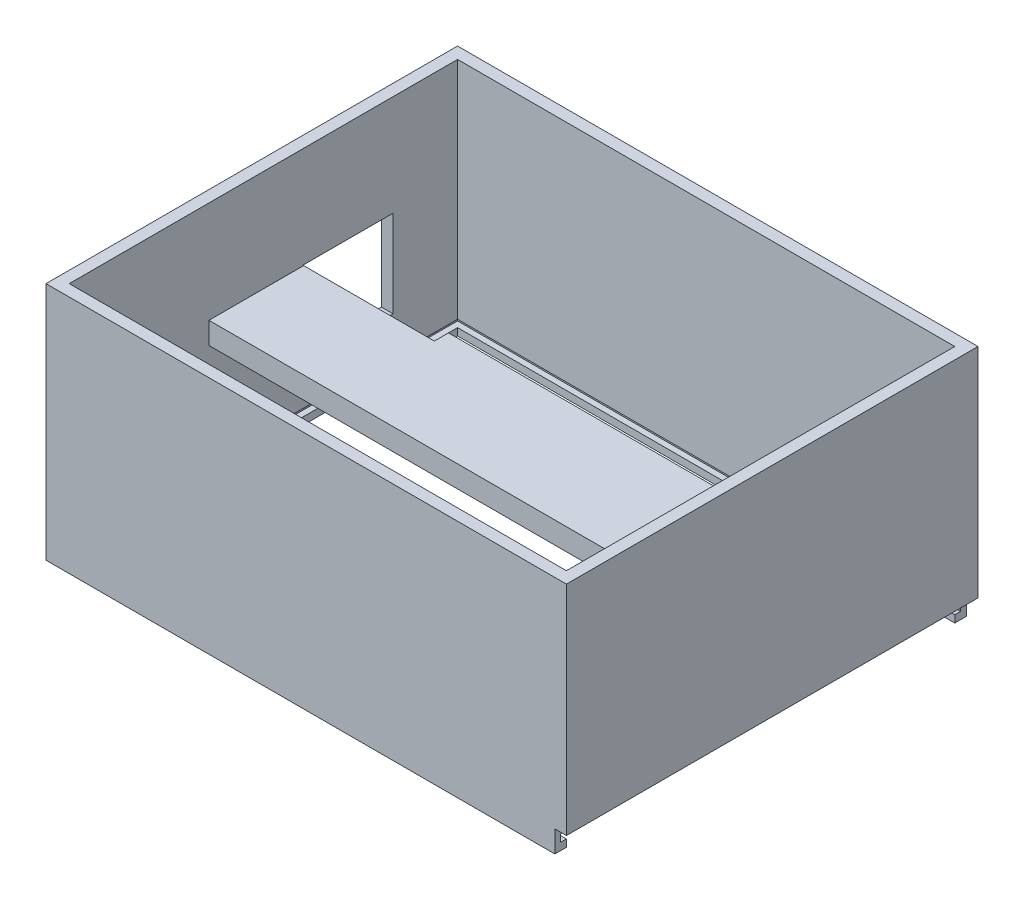
ISO-10303-21;
HEADER;
FILE_DESCRIPTION(('STEP AP214'),'2;1');
FILE_NAME('part.step','',(''),(''),'','','');
FILE_SCHEMA(('AUTOMOTIVE_DESIGN { 1 0 10303 214 1 1 1 1 }'));
ENDSEC;
DATA;
#1=APPLICATION_CONTEXT('core data for automotive mechanical design processes');
#2=APPLICATION_PROTOCOL_DEFINITION('international standard','automotive_design',2000,#1);
#3=PRODUCT_CONTEXT('',#1,'mechanical');
#4=PRODUCT('Part','Part','',(#3));
#5=PRODUCT_RELATED_PRODUCT_CATEGORY('part','',(#4));
#6=PRODUCT_DEFINITION_FORMATION('','',#4);
#7=PRODUCT_DEFINITION_CONTEXT('part definition',#1,'design');
#8=PRODUCT_DEFINITION('design','',#6,#7);
#9=PRODUCT_DEFINITION_SHAPE('','',#8);
#10=(LENGTH_UNIT() NAMED_UNIT(*) SI_UNIT(.MILLI.,.METRE.));
#11=(NAMED_UNIT(*) PLANE_ANGLE_UNIT() SI_UNIT($,.RADIAN.));
#12=(NAMED_UNIT(*) SI_UNIT($,.STERADIAN.) SOLID_ANGLE_UNIT());
#13=UNCERTAINTY_MEASURE_WITH_UNIT(LENGTH_MEASURE(1.E-05),#10,'distance_accuracy_value','');
#14=(GEOMETRIC_REPRESENTATION_CONTEXT(3) GLOBAL_UNCERTAINTY_ASSIGNED_CONTEXT((#13)) GLOBAL_UNIT_ASSIGNED_CONTEXT((#10,
#11,#12)) REPRESENTATION_CONTEXT('',''));
#15=CARTESIAN_POINT('',(0.,0.,0.));
#16=DIRECTION('',(0.,0.,1.));
#17=DIRECTION('',(1.,0.,0.));
#18=AXIS2_PLACEMENT_3D('',#15,#16,#17);
#19=CARTESIAN_POINT('',(-33.0209693760518,30.,34.9955036156109));
#20=DIRECTION('',(1.,0.,0.));
#21=DIRECTION('',(0.,0.,-1.));
#22=AXIS2_PLACEMENT_3D('',#19,#20,#21);
#23=PLANE('',#22);
#24=DIRECTION('',(0.,0.,1.));
#25=VECTOR('',#24,1.);
#26=CARTESIAN_POINT('',(-33.0209693760518,-1.,34.9955036156109));
#27=LINE('',#26,#25);
#28=CARTESIAN_POINT('',(-33.0209693760518,-1.,-18.5044963843891));
#29=VERTEX_POINT('',#28);
#30=CARTESIAN_POINT('',(-33.0209693760518,-1.,34.9955036156109));
#31=VERTEX_POINT('',#30);
#32=EDGE_CURVE('E296',#29,#31,#27,.T.);
#33=ORIENTED_EDGE('',*,*,#32,.F.);
#34=DIRECTION('',(0.,-1.,0.));
#35=VECTOR('',#34,1.);
#36=CARTESIAN_POINT('',(-33.0209693760518,30.,-18.5044963843891));
#37=LINE('',#36,#35);
#38=CARTESIAN_POINT('',(-33.0209693760518,30.,-18.5044963843891));
#39=VERTEX_POINT('',#38);
#40=EDGE_CURVE('E460',#39,#29,#37,.T.);
#41=ORIENTED_EDGE('',*,*,#40,.F.);
#42=DIRECTION('',(0.,0.,1.));
#43=VECTOR('',#42,1.);
#44=CARTESIAN_POINT('',(-33.0209693760518,30.,34.9955036156109));
#45=LINE('',#44,#43);
#46=CARTESIAN_POINT('',(-33.0209693760518,30.,34.9955036156109));
#47=VERTEX_POINT('',#46);
#48=EDGE_CURVE('E449',#39,#47,#45,.T.);
#49=ORIENTED_EDGE('',*,*,#48,.T.);
#50=DIRECTION('',(0.,-1.,0.));
#51=VECTOR('',#50,1.);
#52=CARTESIAN_POINT('',(-33.0209693760518,30.,34.9955036156109));
#53=LINE('',#52,#51);
#54=EDGE_CURVE('E470',#47,#31,#53,.T.);
#55=ORIENTED_EDGE('',*,*,#54,.T.);
#56=EDGE_LOOP('',(#33,#41,#49,#55));
#57=FACE_BOUND('',#56,.T.);
#58=DIRECTION('',(0.,-1.,0.));
#59=VECTOR('',#58,1.);
#60=CARTESIAN_POINT('',(-33.0209693760518,4.1,2.69550361561089));
#61=LINE('',#60,#59);
#62=CARTESIAN_POINT('',(-33.0209693760518,16.1,2.69550361561089));
#63=VERTEX_POINT('',#62);
#64=CARTESIAN_POINT('',(-33.0209693760518,16.,2.69550361561089));
#65=VERTEX_POINT('',#64);
#66=EDGE_CURVE('E410',#63,#65,#61,.T.);
#67=ORIENTED_EDGE('',*,*,#66,.F.);
#68=DIRECTION('',(0.,0.,1.));
#69=VECTOR('',#68,1.);
#70=CARTESIAN_POINT('',(-33.0209693760518,16.1,2.69550361561089));
#71=LINE('',#70,#69);
#72=CARTESIAN_POINT('',(-33.0209693760518,16.1,-9.60449638438911));
#73=VERTEX_POINT('',#72);
#74=EDGE_CURVE('E400',#73,#63,#71,.T.);
#75=ORIENTED_EDGE('',*,*,#74,.F.);
#76=DIRECTION('',(0.,1.,0.));
#77=VECTOR('',#76,1.);
#78=CARTESIAN_POINT('',(-33.0209693760518,4.1,-9.60449638438911));
#79=LINE('',#78,#77);
#80=CARTESIAN_POINT('',(-33.0209693760518,4.1,-9.60449638438911));
#81=VERTEX_POINT('',#80);
#82=EDGE_CURVE('E416',#81,#73,#79,.T.);
#83=ORIENTED_EDGE('',*,*,#82,.F.);
#84=DIRECTION('',(0.,0.,-1.));
#85=VECTOR('',#84,1.);
#86=CARTESIAN_POINT('',(-33.0209693760518,4.1,2.69550361561089));
#87=LINE('',#86,#85);
#88=CARTESIAN_POINT('',(-33.0209693760518,4.1,2.69550361561089));
#89=VERTEX_POINT('',#88);
#90=EDGE_CURVE('E413',#89,#81,#87,.T.);
#91=ORIENTED_EDGE('',*,*,#90,.F.);
#92=CARTESIAN_POINT('',(-33.0209693760518,13.,2.69550361561089));
#93=VERTEX_POINT('',#92);
#94=EDGE_CURVE('E389',#93,#89,#61,.T.);
#95=ORIENTED_EDGE('',*,*,#94,.F.);
#96=DIRECTION('',(0.,0.,-1.));
#97=VECTOR('',#96,1.);
#98=CARTESIAN_POINT('',(-33.0209693760518,13.,15.7455036156109));
#99=LINE('',#98,#97);
#100=CARTESIAN_POINT('',(-33.0209693760518,13.,15.7455036156109));
#101=VERTEX_POINT('',#100);
#102=EDGE_CURVE('E432',#101,#93,#99,.T.);
#103=ORIENTED_EDGE('',*,*,#102,.F.);
#104=DIRECTION('',(0.,-1.,0.));
#105=VECTOR('',#104,1.);
#106=CARTESIAN_POINT('',(-33.0209693760518,13.,15.7455036156109));
#107=LINE('',#106,#105);
#108=CARTESIAN_POINT('',(-33.0209693760518,16.,15.7455036156109));
#109=VERTEX_POINT('',#108);
#110=EDGE_CURVE('E423',#109,#101,#107,.T.);
#111=ORIENTED_EDGE('',*,*,#110,.F.);
#112=DIRECTION('',(0.,0.,1.));
#113=VECTOR('',#112,1.);
#114=CARTESIAN_POINT('',(-33.0209693760518,16.,15.7455036156109));
#115=LINE('',#114,#113);
#116=EDGE_CURVE('E435',#65,#109,#115,.T.);
#117=ORIENTED_EDGE('',*,*,#116,.F.);
#118=EDGE_LOOP('',(#67,#75,#83,#91,#95,#103,#111,#117));
#119=FACE_BOUND('',#118,.T.);
#120=DIRECTION('',(0.,-1.,0.));
#121=VECTOR('',#120,1.);
#122=CARTESIAN_POINT('',(-33.0209693760518,4.1,31.7955036156109));
#123=LINE('',#122,#121);
#124=CARTESIAN_POINT('',(-33.0209693760518,15.1,31.7955036156109));
#125=VERTEX_POINT('',#124);
#126=CARTESIAN_POINT('',(-33.0209693760518,4.1,31.7955036156109));
#127=VERTEX_POINT('',#126);
#128=EDGE_CURVE('E363',#125,#127,#123,.T.);
#129=ORIENTED_EDGE('',*,*,#128,.F.);
#130=DIRECTION('',(0.,0.,1.));
#131=VECTOR('',#130,1.);
#132=CARTESIAN_POINT('',(-33.0209693760518,15.1,31.7955036156109));
#133=LINE('',#132,#131);
#134=CARTESIAN_POINT('',(-33.0209693760518,15.1,22.4955036156109));
#135=VERTEX_POINT('',#134);
#136=EDGE_CURVE('E368',#135,#125,#133,.T.);
#137=ORIENTED_EDGE('',*,*,#136,.F.);
#138=DIRECTION('',(0.,1.,0.));
#139=VECTOR('',#138,1.);
#140=CARTESIAN_POINT('',(-33.0209693760518,4.1,22.4955036156109));
#141=LINE('',#140,#139);
#142=CARTESIAN_POINT('',(-33.0209693760518,4.1,22.4955036156109));
#143=VERTEX_POINT('',#142);
#144=EDGE_CURVE('E382',#143,#135,#141,.T.);
#145=ORIENTED_EDGE('',*,*,#144,.F.);
#146=DIRECTION('',(0.,0.,-1.));
#147=VECTOR('',#146,1.);
#148=CARTESIAN_POINT('',(-33.0209693760518,4.1,31.7955036156109));
#149=LINE('',#148,#147);
#150=EDGE_CURVE('E379',#127,#143,#149,.T.);
#151=ORIENTED_EDGE('',*,*,#150,.F.);
#152=EDGE_LOOP('',(#129,#137,#145,#151));
#153=FACE_BOUND('',#152,.T.);
#154=ADVANCED_FACE('F33',(#57,#119,#153),#23,.T.);
#155=CARTESIAN_POINT('',(-33.0209693760518,30.,34.9955036156109));
#156=DIRECTION('',(0.,0.,-1.));
#157=DIRECTION('',(-1.,0.,0.));
#158=AXIS2_PLACEMENT_3D('',#155,#156,#157);
#159=PLANE('',#158);
#160=DIRECTION('',(1.,0.,0.));
#161=VECTOR('',#160,1.);
#162=CARTESIAN_POINT('',(-33.0209693760518,-1.,34.9955036156109));
#163=LINE('',#162,#161);
#164=CARTESIAN_POINT('',(35.4790306239482,-1.,34.9955036156109));
#165=VERTEX_POINT('',#164);
#166=EDGE_CURVE('E298',#31,#165,#163,.T.);
#167=ORIENTED_EDGE('',*,*,#166,.F.);
#168=ORIENTED_EDGE('',*,*,#54,.F.);
#169=DIRECTION('',(1.,0.,0.));
#170=VECTOR('',#169,1.);
#171=CARTESIAN_POINT('',(-33.0209693760518,30.,34.9955036156109));
#172=LINE('',#171,#170);
#173=CARTESIAN_POINT('',(35.4790306239482,30.,34.9955036156109));
#174=VERTEX_POINT('',#173);
#175=EDGE_CURVE('E451',#47,#174,#172,.T.);
#176=ORIENTED_EDGE('',*,*,#175,.T.);
#177=DIRECTION('',(0.,-1.,0.));
#178=VECTOR('',#177,1.);
#179=CARTESIAN_POINT('',(35.4790306239482,30.,34.9955036156109));
#180=LINE('',#179,#178);
#181=CARTESIAN_POINT('',(35.4790306239482,0.,34.9955036156109));
#182=VERTEX_POINT('',#181);
#183=EDGE_CURVE('E466',#174,#182,#180,.T.);
#184=ORIENTED_EDGE('',*,*,#183,.T.);
#185=DIRECTION('',(0.,1.,0.));
#186=VECTOR('',#185,1.);
#187=CARTESIAN_POINT('',(35.4790306239482,-3.,34.9955036156109));
#188=LINE('',#187,#186);
#189=EDGE_CURVE('E333',#165,#182,#188,.T.);
#190=ORIENTED_EDGE('',*,*,#189,.F.);
#191=EDGE_LOOP('',(#167,#168,#176,#184,#190));
#192=FACE_BOUND('',#191,.T.);
#193=ADVANCED_FACE('F531',(#192),#159,.T.);
#194=CARTESIAN_POINT('',(-33.0209693760518,30.,-18.5044963843891));
#195=DIRECTION('',(0.,0.,1.));
#196=DIRECTION('',(1.,0.,0.));
#197=AXIS2_PLACEMENT_3D('',#194,#195,#196);
#198=PLANE('',#197);
#199=DIRECTION('',(-1.,0.,0.));
#200=VECTOR('',#199,1.);
#201=CARTESIAN_POINT('',(-33.0209693760518,-1.,-18.5044963843891));
#202=LINE('',#201,#200);
#203=CARTESIAN_POINT('',(35.4790306239482,-1.,-18.5044963843891));
#204=VERTEX_POINT('',#203);
#205=EDGE_CURVE('E294',#204,#29,#202,.T.);
#206=ORIENTED_EDGE('',*,*,#205,.F.);
#207=DIRECTION('',(0.,1.,0.));
#208=VECTOR('',#207,1.);
#209=CARTESIAN_POINT('',(35.4790306239482,-3.,-18.5044963843891));
#210=LINE('',#209,#208);
#211=CARTESIAN_POINT('',(35.4790306239482,0.,-18.5044963843891));
#212=VERTEX_POINT('',#211);
#213=EDGE_CURVE('E341',#204,#212,#210,.T.);
#214=ORIENTED_EDGE('',*,*,#213,.T.);
#215=DIRECTION('',(0.,-1.,0.));
#216=VECTOR('',#215,1.);
#217=CARTESIAN_POINT('',(35.4790306239482,30.,-18.5044963843891));
#218=LINE('',#217,#216);
#219=CARTESIAN_POINT('',(35.4790306239482,30.,-18.5044963843891));
#220=VERTEX_POINT('',#219);
#221=EDGE_CURVE('E463',#220,#212,#218,.T.);
#222=ORIENTED_EDGE('',*,*,#221,.F.);
#223=DIRECTION('',(-1.,0.,0.));
#224=VECTOR('',#223,1.);
#225=CARTESIAN_POINT('',(-33.0209693760518,30.,-18.5044963843891));
#226=LINE('',#225,#224);
#227=EDGE_CURVE('E456',#220,#39,#226,.T.);
#228=ORIENTED_EDGE('',*,*,#227,.T.);
#229=ORIENTED_EDGE('',*,*,#40,.T.);
#230=EDGE_LOOP('',(#206,#214,#222,#228,#229));
#231=FACE_BOUND('',#230,.T.);
#232=ADVANCED_FACE('F520',(#231),#198,.T.);
#233=CARTESIAN_POINT('',(0.,0.,0.));
#234=DIRECTION('',(0.,1.,0.));
#235=DIRECTION('',(0.,0.,1.));
#236=AXIS2_PLACEMENT_3D('',#233,#234,#235);
#237=PLANE('',#236);
#238=DIRECTION('',(0.,0.,1.));
#239=VECTOR('',#238,1.);
#240=CARTESIAN_POINT('',(35.4790306239482,0.,36.5955036156109));
#241=LINE('',#240,#239);
#242=CARTESIAN_POINT('',(35.4790306239482,0.,36.5955036156109));
#243=VERTEX_POINT('',#242);
#244=EDGE_CURVE('E305',#182,#243,#241,.T.);
#245=ORIENTED_EDGE('',*,*,#244,.F.);
#246=DIRECTION('',(0.,0.,-1.));
#247=VECTOR('',#246,1.);
#248=CARTESIAN_POINT('',(35.4790306239482,0.,34.9955036156109));
#249=LINE('',#248,#247);
#250=EDGE_CURVE('E448',#182,#212,#249,.T.);
#251=ORIENTED_EDGE('',*,*,#250,.T.);
#252=DIRECTION('',(0.,0.,1.));
#253=VECTOR('',#252,1.);
#254=CARTESIAN_POINT('',(35.4790306239482,0.,-18.5044963843891));
#255=LINE('',#254,#253);
#256=CARTESIAN_POINT('',(35.4790306239482,0.,-20.1044963843891));
#257=VERTEX_POINT('',#256);
#258=EDGE_CURVE('E300',#257,#212,#255,.T.);
#259=ORIENTED_EDGE('',*,*,#258,.F.);
#260=DIRECTION('',(-1.,0.,0.));
#261=VECTOR('',#260,1.);
#262=CARTESIAN_POINT('',(-34.6209693760518,0.,-20.1044963843891));
#263=LINE('',#262,#261);
#264=CARTESIAN_POINT('',(37.0790306239482,0.,-20.1044963843891));
#265=VERTEX_POINT('',#264);
#266=EDGE_CURVE('E477',#265,#257,#263,.T.);
#267=ORIENTED_EDGE('',*,*,#266,.F.);
#268=DIRECTION('',(0.,0.,-1.));
#269=VECTOR('',#268,1.);
#270=CARTESIAN_POINT('',(37.0790306239482,0.,-20.1044963843891));
#271=LINE('',#270,#269);
#272=CARTESIAN_POINT('',(37.0790306239482,0.,36.5955036156109));
#273=VERTEX_POINT('',#272);
#274=EDGE_CURVE('E486',#273,#265,#271,.T.);
#275=ORIENTED_EDGE('',*,*,#274,.F.);
#276=DIRECTION('',(1.,0.,0.));
#277=VECTOR('',#276,1.);
#278=CARTESIAN_POINT('',(-34.6209693760518,0.,36.5955036156109));
#279=LINE('',#278,#277);
#280=EDGE_CURVE('E56',#243,#273,#279,.T.);
#281=ORIENTED_EDGE('',*,*,#280,.F.);
#282=EDGE_LOOP('',(#245,#251,#259,#267,#275,#281));
#283=FACE_BOUND('',#282,.T.);
#284=ADVANCED_FACE('F517',(#283),#237,.F.);
#285=CARTESIAN_POINT('',(36.9790306239482,13.,15.7455036156109));
#286=DIRECTION('',(0.,1.,0.));
#287=DIRECTION('',(0.,0.,1.));
#288=AXIS2_PLACEMENT_3D('',#285,#286,#287);
#289=PLANE('',#288);
#290=DIRECTION('',(-1.,0.,0.));
#291=VECTOR('',#290,1.);
#292=CARTESIAN_POINT('',(36.9790306239482,13.,2.69550361561089));
#293=LINE('',#292,#291);
#294=CARTESIAN_POINT('',(-15.0209693760518,13.,2.69550361561089));
#295=VERTEX_POINT('',#294);
#296=EDGE_CURVE('E357',#295,#93,#293,.T.);
#297=ORIENTED_EDGE('',*,*,#296,.F.);
#298=DIRECTION('',(0.,0.,1.));
#299=VECTOR('',#298,1.);
#300=CARTESIAN_POINT('',(-15.0209693760518,13.,15.7455036156109));
#301=LINE('',#300,#299);
#302=CARTESIAN_POINT('',(-15.0209693760518,13.,0.745503615610894));
#303=VERTEX_POINT('',#302);
#304=EDGE_CURVE('E361',#303,#295,#301,.T.);
#305=ORIENTED_EDGE('',*,*,#304,.F.);
#306=DIRECTION('',(-1.,0.,0.));
#307=VECTOR('',#306,1.);
#308=CARTESIAN_POINT('',(36.9790306239482,13.,0.745503615610894));
#309=LINE('',#308,#307);
#310=CARTESIAN_POINT('',(35.4790306239482,13.,0.745503615610894));
#311=VERTEX_POINT('',#310);
#312=EDGE_CURVE('E443',#311,#303,#309,.T.);
#313=ORIENTED_EDGE('',*,*,#312,.F.);
#314=DIRECTION('',(0.,0.,-1.));
#315=VECTOR('',#314,1.);
#316=CARTESIAN_POINT('',(35.4790306239482,13.,34.9955036156109));
#317=LINE('',#316,#315);
#318=CARTESIAN_POINT('',(35.4790306239482,13.,15.7455036156109));
#319=VERTEX_POINT('',#318);
#320=EDGE_CURVE('E616',#319,#311,#317,.T.);
#321=ORIENTED_EDGE('',*,*,#320,.F.);
#322=DIRECTION('',(-1.,0.,0.));
#323=VECTOR('',#322,1.);
#324=CARTESIAN_POINT('',(36.9790306239482,13.,15.7455036156109));
#325=LINE('',#324,#323);
#326=EDGE_CURVE('E446',#319,#101,#325,.T.);
#327=ORIENTED_EDGE('',*,*,#326,.T.);
#328=ORIENTED_EDGE('',*,*,#102,.T.);
#329=EDGE_LOOP('',(#297,#305,#313,#321,#327,#328));
#330=FACE_BOUND('',#329,.T.);
#331=ADVANCED_FACE('F519',(#330),#289,.F.);
#332=CARTESIAN_POINT('',(36.9790306239482,13.,0.745503615610894));
#333=DIRECTION('',(0.,0.,1.));
#334=DIRECTION('',(1.,0.,0.));
#335=AXIS2_PLACEMENT_3D('',#332,#333,#334);
#336=PLANE('',#335);
#337=DIRECTION('',(0.,-1.,0.));
#338=VECTOR('',#337,1.);
#339=CARTESIAN_POINT('',(-15.0209693760518,13.,0.745503615610894));
#340=LINE('',#339,#338);
#341=CARTESIAN_POINT('',(-15.0209693760518,16.,0.745503615610894));
#342=VERTEX_POINT('',#341);
#343=EDGE_CURVE('E359',#342,#303,#340,.T.);
#344=ORIENTED_EDGE('',*,*,#343,.F.);
#345=DIRECTION('',(-1.,0.,0.));
#346=VECTOR('',#345,1.);
#347=CARTESIAN_POINT('',(36.9790306239482,16.,0.745503615610894));
#348=LINE('',#347,#346);
#349=CARTESIAN_POINT('',(35.4790306239482,16.,0.745503615610894));
#350=VERTEX_POINT('',#349);
#351=EDGE_CURVE('E440',#350,#342,#348,.T.);
#352=ORIENTED_EDGE('',*,*,#351,.F.);
#353=DIRECTION('',(0.,1.,0.));
#354=VECTOR('',#353,1.);
#355=CARTESIAN_POINT('',(35.4790306239482,30.,0.74550361561089));
#356=LINE('',#355,#354);
#357=EDGE_CURVE('E609',#311,#350,#356,.T.);
#358=ORIENTED_EDGE('',*,*,#357,.F.);
#359=ORIENTED_EDGE('',*,*,#312,.T.);
#360=EDGE_LOOP('',(#344,#352,#358,#359));
#361=FACE_BOUND('',#360,.T.);
#362=ADVANCED_FACE('F527',(#361),#336,.F.);
#363=CARTESIAN_POINT('',(36.9790306239482,16.,15.7455036156109));
#364=DIRECTION('',(0.,-1.,0.));
#365=DIRECTION('',(0.,0.,-1.));
#366=AXIS2_PLACEMENT_3D('',#363,#364,#365);
#367=PLANE('',#366);
#368=DIRECTION('',(1.,0.,0.));
#369=VECTOR('',#368,1.);
#370=CARTESIAN_POINT('',(36.9790306239482,16.,2.69550361561089));
#371=LINE('',#370,#369);
#372=CARTESIAN_POINT('',(-15.0209693760518,16.,2.69550361561089));
#373=VERTEX_POINT('',#372);
#374=EDGE_CURVE('E355',#65,#373,#371,.T.);
#375=ORIENTED_EDGE('',*,*,#374,.F.);
#376=ORIENTED_EDGE('',*,*,#116,.T.);
#377=DIRECTION('',(-1.,0.,0.));
#378=VECTOR('',#377,1.);
#379=CARTESIAN_POINT('',(36.9790306239482,16.,15.7455036156109));
#380=LINE('',#379,#378);
#381=CARTESIAN_POINT('',(35.4790306239482,16.,15.7455036156109));
#382=VERTEX_POINT('',#381);
#383=EDGE_CURVE('E437',#382,#109,#380,.T.);
#384=ORIENTED_EDGE('',*,*,#383,.F.);
#385=DIRECTION('',(0.,0.,1.));
#386=VECTOR('',#385,1.);
#387=CARTESIAN_POINT('',(35.4790306239482,16.,34.9955036156109));
#388=LINE('',#387,#386);
#389=EDGE_CURVE('E606',#350,#382,#388,.T.);
#390=ORIENTED_EDGE('',*,*,#389,.F.);
#391=ORIENTED_EDGE('',*,*,#351,.T.);
#392=DIRECTION('',(0.,0.,-1.));
#393=VECTOR('',#392,1.);
#394=CARTESIAN_POINT('',(-15.0209693760518,16.,15.7455036156109));
#395=LINE('',#394,#393);
#396=EDGE_CURVE('E41',#373,#342,#395,.T.);
#397=ORIENTED_EDGE('',*,*,#396,.F.);
#398=EDGE_LOOP('',(#375,#376,#384,#390,#391,#397));
#399=FACE_BOUND('',#398,.T.);
#400=ADVANCED_FACE('F551',(#399),#367,.F.);
#401=DIRECTION('',(0.,0.,-1.));
#402=VECTOR('',#401,1.);
#403=CARTESIAN_POINT('',(-33.0209693760518,-2.,34.9955036156109));
#404=LINE('',#403,#402);
#405=CARTESIAN_POINT('',(-33.0209693760518,-2.,34.9955036156109));
#406=VERTEX_POINT('',#405);
#407=CARTESIAN_POINT('',(-33.0209693760518,-2.,-18.5044963843891));
#408=VERTEX_POINT('',#407);
#409=EDGE_CURVE('E290',#406,#408,#404,.T.);
#410=ORIENTED_EDGE('',*,*,#409,.F.);
#411=CARTESIAN_POINT('',(-33.0209693760518,-3.,34.9955036156109));
#412=VERTEX_POINT('',#411);
#413=EDGE_CURVE('E469',#406,#412,#53,.T.);
#414=ORIENTED_EDGE('',*,*,#413,.T.);
#415=DIRECTION('',(0.,0.,1.));
#416=VECTOR('',#415,1.);
#417=CARTESIAN_POINT('',(-33.0209693760518,-3.,34.9955036156109));
#418=LINE('',#417,#416);
#419=CARTESIAN_POINT('',(-33.0209693760518,-3.,-18.5044963843891));
#420=VERTEX_POINT('',#419);
#421=EDGE_CURVE('E315',#420,#412,#418,.T.);
#422=ORIENTED_EDGE('',*,*,#421,.F.);
#423=EDGE_CURVE('E458',#408,#420,#37,.T.);
#424=ORIENTED_EDGE('',*,*,#423,.F.);
#425=EDGE_LOOP('',(#410,#414,#422,#424));
#426=FACE_BOUND('',#425,.T.);
#427=ADVANCED_FACE('F539',(#426),#23,.T.);
#428=CARTESIAN_POINT('',(35.4790306239482,30.,34.9955036156109));
#429=DIRECTION('',(-1.,0.,0.));
#430=DIRECTION('',(0.,0.,1.));
#431=AXIS2_PLACEMENT_3D('',#428,#429,#430);
#432=PLANE('',#431);
#433=ORIENTED_EDGE('',*,*,#250,.F.);
#434=ORIENTED_EDGE('',*,*,#183,.F.);
#435=DIRECTION('',(0.,0.,-1.));
#436=VECTOR('',#435,1.);
#437=CARTESIAN_POINT('',(35.4790306239482,30.,34.9955036156109));
#438=LINE('',#437,#436);
#439=EDGE_CURVE('E453',#174,#220,#438,.T.);
#440=ORIENTED_EDGE('',*,*,#439,.T.);
#441=ORIENTED_EDGE('',*,*,#221,.T.);
#442=EDGE_LOOP('',(#433,#434,#440,#441));
#443=FACE_BOUND('',#442,.T.);
#444=ORIENTED_EDGE('',*,*,#389,.T.);
#445=DIRECTION('',(0.,-1.,0.));
#446=VECTOR('',#445,1.);
#447=CARTESIAN_POINT('',(35.4790306239482,30.,15.7455036156109));
#448=LINE('',#447,#446);
#449=EDGE_CURVE('E619',#382,#319,#448,.T.);
#450=ORIENTED_EDGE('',*,*,#449,.T.);
#451=ORIENTED_EDGE('',*,*,#320,.T.);
#452=ORIENTED_EDGE('',*,*,#357,.T.);
#453=EDGE_LOOP('',(#444,#450,#451,#452));
#454=FACE_BOUND('',#453,.T.);
#455=ADVANCED_FACE('F550',(#443,#454),#432,.T.);
#456=CARTESIAN_POINT('',(0.,30.,0.));
#457=DIRECTION('',(0.,1.,0.));
#458=DIRECTION('',(0.,0.,1.));
#459=AXIS2_PLACEMENT_3D('',#456,#457,#458);
#460=PLANE('',#459);
#461=DIRECTION('',(0.,0.,1.));
#462=VECTOR('',#461,1.);
#463=CARTESIAN_POINT('',(-34.6209693760518,30.,-20.1044963843891));
#464=LINE('',#463,#462);
#465=CARTESIAN_POINT('',(-34.6209693760518,30.,-20.1044963843891));
#466=VERTEX_POINT('',#465);
#467=CARTESIAN_POINT('',(-34.6209693760518,30.,36.5955036156109));
#468=VERTEX_POINT('',#467);
#469=EDGE_CURVE('E473',#466,#468,#464,.T.);
#470=ORIENTED_EDGE('',*,*,#469,.T.);
#471=DIRECTION('',(1.,0.,0.));
#472=VECTOR('',#471,1.);
#473=CARTESIAN_POINT('',(-34.6209693760518,30.,36.5955036156109));
#474=LINE('',#473,#472);
#475=CARTESIAN_POINT('',(37.0790306239482,30.,36.5955036156109));
#476=VERTEX_POINT('',#475);
#477=EDGE_CURVE('E476',#468,#476,#474,.T.);
#478=ORIENTED_EDGE('',*,*,#477,.T.);
#479=DIRECTION('',(0.,0.,-1.));
#480=VECTOR('',#479,1.);
#481=CARTESIAN_POINT('',(37.0790306239482,30.,-20.1044963843891));
#482=LINE('',#481,#480);
#483=CARTESIAN_POINT('',(37.0790306239482,30.,-20.1044963843891));
#484=VERTEX_POINT('',#483);
#485=EDGE_CURVE('E479',#476,#484,#482,.T.);
#486=ORIENTED_EDGE('',*,*,#485,.T.);
#487=DIRECTION('',(-1.,0.,0.));
#488=VECTOR('',#487,1.);
#489=CARTESIAN_POINT('',(-34.6209693760518,30.,-20.1044963843891));
#490=LINE('',#489,#488);
#491=EDGE_CURVE('E481',#484,#466,#490,.T.);
#492=ORIENTED_EDGE('',*,*,#491,.T.);
#493=EDGE_LOOP('',(#470,#478,#486,#492));
#494=FACE_BOUND('',#493,.T.);
#495=ORIENTED_EDGE('',*,*,#175,.F.);
#496=ORIENTED_EDGE('',*,*,#48,.F.);
#497=ORIENTED_EDGE('',*,*,#227,.F.);
#498=ORIENTED_EDGE('',*,*,#439,.F.);
#499=EDGE_LOOP('',(#495,#496,#497,#498));
#500=FACE_BOUND('',#499,.T.);
#501=ADVANCED_FACE('F556',(#494,#500),#460,.T.);
#502=CARTESIAN_POINT('',(-34.6209693760518,30.,-20.1044963843891));
#503=DIRECTION('',(1.,0.,0.));
#504=DIRECTION('',(0.,0.,-1.));
#505=AXIS2_PLACEMENT_3D('',#502,#503,#504);
#506=PLANE('',#505);
#507=DIRECTION('',(0.,0.,1.));
#508=VECTOR('',#507,1.);
#509=CARTESIAN_POINT('',(-34.6209693760518,15.1,31.7955036156109));
#510=LINE('',#509,#508);
#511=CARTESIAN_POINT('',(-34.6209693760518,15.1,22.4955036156109));
#512=VERTEX_POINT('',#511);
#513=CARTESIAN_POINT('',(-34.6209693760518,15.1,31.7955036156109));
#514=VERTEX_POINT('',#513);
#515=EDGE_CURVE('E374',#512,#514,#510,.T.);
#516=ORIENTED_EDGE('',*,*,#515,.T.);
#517=DIRECTION('',(0.,-1.,0.));
#518=VECTOR('',#517,1.);
#519=CARTESIAN_POINT('',(-34.6209693760518,4.1,31.7955036156109));
#520=LINE('',#519,#518);
#521=CARTESIAN_POINT('',(-34.6209693760518,4.1,31.7955036156109));
#522=VERTEX_POINT('',#521);
#523=EDGE_CURVE('E364',#514,#522,#520,.T.);
#524=ORIENTED_EDGE('',*,*,#523,.T.);
#525=DIRECTION('',(0.,0.,-1.));
#526=VECTOR('',#525,1.);
#527=CARTESIAN_POINT('',(-34.6209693760518,4.1,31.7955036156109));
#528=LINE('',#527,#526);
#529=CARTESIAN_POINT('',(-34.6209693760518,4.1,22.4955036156109));
#530=VERTEX_POINT('',#529);
#531=EDGE_CURVE('E367',#522,#530,#528,.T.);
#532=ORIENTED_EDGE('',*,*,#531,.T.);
#533=DIRECTION('',(0.,1.,0.));
#534=VECTOR('',#533,1.);
#535=CARTESIAN_POINT('',(-34.6209693760518,4.1,22.4955036156109));
#536=LINE('',#535,#534);
#537=EDGE_CURVE('E371',#530,#512,#536,.T.);
#538=ORIENTED_EDGE('',*,*,#537,.T.);
#539=EDGE_LOOP('',(#516,#524,#532,#538));
#540=FACE_BOUND('',#539,.T.);
#541=DIRECTION('',(0.,0.,1.));
#542=VECTOR('',#541,1.);
#543=CARTESIAN_POINT('',(-34.6209693760518,16.1,2.69550361561089));
#544=LINE('',#543,#542);
#545=CARTESIAN_POINT('',(-34.6209693760518,16.1,-9.60449638438911));
#546=VERTEX_POINT('',#545);
#547=CARTESIAN_POINT('',(-34.6209693760518,16.1,2.69550361561089));
#548=VERTEX_POINT('',#547);
#549=EDGE_CURVE('E406',#546,#548,#544,.T.);
#550=ORIENTED_EDGE('',*,*,#549,.T.);
#551=DIRECTION('',(0.,-1.,0.));
#552=VECTOR('',#551,1.);
#553=CARTESIAN_POINT('',(-34.6209693760518,4.1,2.69550361561089));
#554=LINE('',#553,#552);
#555=CARTESIAN_POINT('',(-34.6209693760518,4.1,2.69550361561089));
#556=VERTEX_POINT('',#555);
#557=EDGE_CURVE('E396',#548,#556,#554,.T.);
#558=ORIENTED_EDGE('',*,*,#557,.T.);
#559=DIRECTION('',(0.,0.,-1.));
#560=VECTOR('',#559,1.);
#561=CARTESIAN_POINT('',(-34.6209693760518,4.1,2.69550361561089));
#562=LINE('',#561,#560);
#563=CARTESIAN_POINT('',(-34.6209693760518,4.1,-9.60449638438911));
#564=VERTEX_POINT('',#563);
#565=EDGE_CURVE('E399',#556,#564,#562,.T.);
#566=ORIENTED_EDGE('',*,*,#565,.T.);
#567=DIRECTION('',(0.,1.,0.));
#568=VECTOR('',#567,1.);
#569=CARTESIAN_POINT('',(-34.6209693760518,4.1,-9.60449638438911));
#570=LINE('',#569,#568);
#571=EDGE_CURVE('E403',#564,#546,#570,.T.);
#572=ORIENTED_EDGE('',*,*,#571,.T.);
#573=EDGE_LOOP('',(#550,#558,#566,#572));
#574=FACE_BOUND('',#573,.T.);
#575=DIRECTION('',(0.,-1.,0.));
#576=VECTOR('',#575,1.);
#577=CARTESIAN_POINT('',(-34.6209693760518,30.,-20.1044963843891));
#578=LINE('',#577,#576);
#579=CARTESIAN_POINT('',(-34.6209693760518,-3.,-20.1044963843891));
#580=VERTEX_POINT('',#579);
#581=EDGE_CURVE('E483',#466,#580,#578,.T.);
#582=ORIENTED_EDGE('',*,*,#581,.T.);
#583=DIRECTION('',(0.,0.,-1.));
#584=VECTOR('',#583,1.);
#585=CARTESIAN_POINT('',(-34.6209693760518,-3.,-20.1044963843891));
#586=LINE('',#585,#584);
#587=CARTESIAN_POINT('',(-34.6209693760518,-3.,36.5955036156109));
#588=VERTEX_POINT('',#587);
#589=EDGE_CURVE('E304',#588,#580,#586,.T.);
#590=ORIENTED_EDGE('',*,*,#589,.F.);
#591=DIRECTION('',(0.,-1.,0.));
#592=VECTOR('',#591,1.);
#593=CARTESIAN_POINT('',(-34.6209693760518,30.,36.5955036156109));
#594=LINE('',#593,#592);
#595=EDGE_CURVE('E605',#468,#588,#594,.T.);
#596=ORIENTED_EDGE('',*,*,#595,.F.);
#597=ORIENTED_EDGE('',*,*,#469,.F.);
#598=EDGE_LOOP('',(#582,#590,#596,#597));
#599=FACE_BOUND('',#598,.T.);
#600=ADVANCED_FACE('F35',(#540,#574,#599),#506,.F.);
#601=CARTESIAN_POINT('',(-34.6209693760518,30.,36.5955036156109));
#602=DIRECTION('',(0.,0.,-1.));
#603=DIRECTION('',(-1.,0.,0.));
#604=AXIS2_PLACEMENT_3D('',#601,#602,#603);
#605=PLANE('',#604);
#606=ORIENTED_EDGE('',*,*,#595,.T.);
#607=DIRECTION('',(-1.,0.,0.));
#608=VECTOR('',#607,1.);
#609=CARTESIAN_POINT('',(-34.6209693760518,-3.,36.5955036156109));
#610=LINE('',#609,#608);
#611=CARTESIAN_POINT('',(35.4790306239482,-3.,36.5955036156109));
#612=VERTEX_POINT('',#611);
#613=EDGE_CURVE('E301',#612,#588,#610,.T.);
#614=ORIENTED_EDGE('',*,*,#613,.F.);
#615=DIRECTION('',(0.,1.,0.));
#616=VECTOR('',#615,1.);
#617=CARTESIAN_POINT('',(35.4790306239482,-3.,36.5955036156109));
#618=LINE('',#617,#616);
#619=EDGE_CURVE('E322',#612,#243,#618,.T.);
#620=ORIENTED_EDGE('',*,*,#619,.T.);
#621=ORIENTED_EDGE('',*,*,#280,.T.);
#622=DIRECTION('',(0.,-1.,0.));
#623=VECTOR('',#622,1.);
#624=CARTESIAN_POINT('',(37.0790306239482,30.,36.5955036156109));
#625=LINE('',#624,#623);
#626=EDGE_CURVE('E516',#476,#273,#625,.T.);
#627=ORIENTED_EDGE('',*,*,#626,.F.);
#628=ORIENTED_EDGE('',*,*,#477,.F.);
#629=EDGE_LOOP('',(#606,#614,#620,#621,#627,#628));
#630=FACE_BOUND('',#629,.T.);
#631=ADVANCED_FACE('F599',(#630),#605,.F.);
#632=CARTESIAN_POINT('',(37.0790306239482,30.,-20.1044963843891));
#633=DIRECTION('',(-1.,0.,0.));
#634=DIRECTION('',(0.,0.,1.));
#635=AXIS2_PLACEMENT_3D('',#632,#633,#634);
#636=PLANE('',#635);
#637=ORIENTED_EDGE('',*,*,#274,.T.);
#638=DIRECTION('',(0.,-1.,0.));
#639=VECTOR('',#638,1.);
#640=CARTESIAN_POINT('',(37.0790306239482,30.,-20.1044963843891));
#641=LINE('',#640,#639);
#642=EDGE_CURVE('E510',#484,#265,#641,.T.);
#643=ORIENTED_EDGE('',*,*,#642,.F.);
#644=ORIENTED_EDGE('',*,*,#485,.F.);
#645=ORIENTED_EDGE('',*,*,#626,.T.);
#646=EDGE_LOOP('',(#637,#643,#644,#645));
#647=FACE_BOUND('',#646,.T.);
#648=ADVANCED_FACE('F513',(#647),#636,.F.);
#649=CARTESIAN_POINT('',(-34.6209693760518,30.,-20.1044963843891));
#650=DIRECTION('',(0.,0.,1.));
#651=DIRECTION('',(1.,0.,0.));
#652=AXIS2_PLACEMENT_3D('',#649,#650,#651);
#653=PLANE('',#652);
#654=ORIENTED_EDGE('',*,*,#266,.T.);
#655=DIRECTION('',(0.,1.,0.));
#656=VECTOR('',#655,1.);
#657=CARTESIAN_POINT('',(35.4790306239482,-3.,-20.1044963843891));
#658=LINE('',#657,#656);
#659=CARTESIAN_POINT('',(35.4790306239482,-3.,-20.1044963843891));
#660=VERTEX_POINT('',#659);
#661=EDGE_CURVE('E350',#660,#257,#658,.T.);
#662=ORIENTED_EDGE('',*,*,#661,.F.);
#663=DIRECTION('',(1.,0.,0.));
#664=VECTOR('',#663,1.);
#665=CARTESIAN_POINT('',(35.4790306239482,-3.,-20.1044963843891));
#666=LINE('',#665,#664);
#667=EDGE_CURVE('E308',#580,#660,#666,.T.);
#668=ORIENTED_EDGE('',*,*,#667,.F.);
#669=ORIENTED_EDGE('',*,*,#581,.F.);
#670=ORIENTED_EDGE('',*,*,#491,.F.);
#671=ORIENTED_EDGE('',*,*,#642,.T.);
#672=EDGE_LOOP('',(#654,#662,#668,#669,#670,#671));
#673=FACE_BOUND('',#672,.T.);
#674=ADVANCED_FACE('F504',(#673),#653,.F.);
#675=DIRECTION('',(-1.,0.,0.));
#676=VECTOR('',#675,1.);
#677=CARTESIAN_POINT('',(-33.0209693760518,-2.,34.9955036156109));
#678=LINE('',#677,#676);
#679=CARTESIAN_POINT('',(35.4790306239482,-2.,34.9955036156109));
#680=VERTEX_POINT('',#679);
#681=EDGE_CURVE('E292',#680,#406,#678,.T.);
#682=ORIENTED_EDGE('',*,*,#681,.F.);
#683=CARTESIAN_POINT('',(35.4790306239482,-3.,34.9955036156109));
#684=VERTEX_POINT('',#683);
#685=EDGE_CURVE('E325',#684,#680,#188,.T.);
#686=ORIENTED_EDGE('',*,*,#685,.F.);
#687=DIRECTION('',(1.,0.,0.));
#688=VECTOR('',#687,1.);
#689=CARTESIAN_POINT('',(35.4790306239482,-3.,34.9955036156109));
#690=LINE('',#689,#688);
#691=EDGE_CURVE('E318',#412,#684,#690,.T.);
#692=ORIENTED_EDGE('',*,*,#691,.F.);
#693=ORIENTED_EDGE('',*,*,#413,.F.);
#694=EDGE_LOOP('',(#682,#686,#692,#693));
#695=FACE_BOUND('',#694,.T.);
#696=ADVANCED_FACE('F546',(#695),#159,.T.);
#697=DIRECTION('',(1.,0.,0.));
#698=VECTOR('',#697,1.);
#699=CARTESIAN_POINT('',(-33.0209693760518,-2.,-18.5044963843891));
#700=LINE('',#699,#698);
#701=CARTESIAN_POINT('',(35.4790306239482,-2.,-18.5044963843891));
#702=VERTEX_POINT('',#701);
#703=EDGE_CURVE('E285',#408,#702,#700,.T.);
#704=ORIENTED_EDGE('',*,*,#703,.F.);
#705=ORIENTED_EDGE('',*,*,#423,.T.);
#706=DIRECTION('',(-1.,0.,0.));
#707=VECTOR('',#706,1.);
#708=CARTESIAN_POINT('',(-33.0209693760518,-3.,-18.5044963843891));
#709=LINE('',#708,#707);
#710=CARTESIAN_POINT('',(35.4790306239482,-3.,-18.5044963843891));
#711=VERTEX_POINT('',#710);
#712=EDGE_CURVE('E312',#711,#420,#709,.T.);
#713=ORIENTED_EDGE('',*,*,#712,.F.);
#714=EDGE_CURVE('E344',#711,#702,#210,.T.);
#715=ORIENTED_EDGE('',*,*,#714,.T.);
#716=EDGE_LOOP('',(#704,#705,#713,#715));
#717=FACE_BOUND('',#716,.T.);
#718=ADVANCED_FACE('F533',(#717),#198,.T.);
#719=CARTESIAN_POINT('',(36.9790306239482,13.,15.7455036156109));
#720=DIRECTION('',(0.,0.,-1.));
#721=DIRECTION('',(-1.,0.,0.));
#722=AXIS2_PLACEMENT_3D('',#719,#720,#721);
#723=PLANE('',#722);
#724=ORIENTED_EDGE('',*,*,#449,.F.);
#725=ORIENTED_EDGE('',*,*,#383,.T.);
#726=ORIENTED_EDGE('',*,*,#110,.T.);
#727=ORIENTED_EDGE('',*,*,#326,.F.);
#728=EDGE_LOOP('',(#724,#725,#726,#727));
#729=FACE_BOUND('',#728,.T.);
#730=ADVANCED_FACE('F640',(#729),#723,.F.);
#731=CARTESIAN_POINT('',(-34.6209693760518,4.1,2.69550361561089));
#732=DIRECTION('',(0.,0.,1.));
#733=DIRECTION('',(1.,0.,0.));
#734=AXIS2_PLACEMENT_3D('',#731,#732,#733);
#735=PLANE('',#734);
#736=ORIENTED_EDGE('',*,*,#66,.T.);
#737=ORIENTED_EDGE('',*,*,#374,.T.);
#738=DIRECTION('',(0.,-1.,0.));
#739=VECTOR('',#738,1.);
#740=CARTESIAN_POINT('',(-15.0209693760518,4.1,2.69550361561089));
#741=LINE('',#740,#739);
#742=EDGE_CURVE('E352',#373,#295,#741,.T.);
#743=ORIENTED_EDGE('',*,*,#742,.T.);
#744=ORIENTED_EDGE('',*,*,#296,.T.);
#745=ORIENTED_EDGE('',*,*,#94,.T.);
#746=DIRECTION('',(1.,0.,0.));
#747=VECTOR('',#746,1.);
#748=CARTESIAN_POINT('',(-34.6209693760518,4.1,2.69550361561089));
#749=LINE('',#748,#747);
#750=EDGE_CURVE('E409',#556,#89,#749,.T.);
#751=ORIENTED_EDGE('',*,*,#750,.F.);
#752=ORIENTED_EDGE('',*,*,#557,.F.);
#753=DIRECTION('',(1.,0.,0.));
#754=VECTOR('',#753,1.);
#755=CARTESIAN_POINT('',(-34.6209693760518,16.1,2.69550361561089));
#756=LINE('',#755,#754);
#757=EDGE_CURVE('E421',#548,#63,#756,.T.);
#758=ORIENTED_EDGE('',*,*,#757,.T.);
#759=EDGE_LOOP('',(#736,#737,#743,#744,#745,#751,#752,#758));
#760=FACE_BOUND('',#759,.T.);
#761=ADVANCED_FACE('F634',(#760),#735,.F.);
#762=CARTESIAN_POINT('',(-34.6209693760518,16.1,2.69550361561089));
#763=DIRECTION('',(0.,1.,0.));
#764=DIRECTION('',(0.,0.,1.));
#765=AXIS2_PLACEMENT_3D('',#762,#763,#764);
#766=PLANE('',#765);
#767=ORIENTED_EDGE('',*,*,#74,.T.);
#768=ORIENTED_EDGE('',*,*,#757,.F.);
#769=ORIENTED_EDGE('',*,*,#549,.F.);
#770=DIRECTION('',(1.,0.,0.));
#771=VECTOR('',#770,1.);
#772=CARTESIAN_POINT('',(-34.6209693760518,16.1,-9.60449638438911));
#773=LINE('',#772,#771);
#774=EDGE_CURVE('E424',#546,#73,#773,.T.);
#775=ORIENTED_EDGE('',*,*,#774,.T.);
#776=EDGE_LOOP('',(#767,#768,#769,#775));
#777=FACE_BOUND('',#776,.T.);
#778=ADVANCED_FACE('F654',(#777),#766,.F.);
#779=CARTESIAN_POINT('',(-34.6209693760518,4.1,-9.60449638438911));
#780=DIRECTION('',(0.,0.,-1.));
#781=DIRECTION('',(-1.,0.,0.));
#782=AXIS2_PLACEMENT_3D('',#779,#780,#781);
#783=PLANE('',#782);
#784=ORIENTED_EDGE('',*,*,#82,.T.);
#785=ORIENTED_EDGE('',*,*,#774,.F.);
#786=ORIENTED_EDGE('',*,*,#571,.F.);
#787=DIRECTION('',(1.,0.,0.));
#788=VECTOR('',#787,1.);
#789=CARTESIAN_POINT('',(-34.6209693760518,4.1,-9.60449638438911));
#790=LINE('',#789,#788);
#791=EDGE_CURVE('E426',#564,#81,#790,.T.);
#792=ORIENTED_EDGE('',*,*,#791,.T.);
#793=EDGE_LOOP('',(#784,#785,#786,#792));
#794=FACE_BOUND('',#793,.T.);
#795=ADVANCED_FACE('F656',(#794),#783,.F.);
#796=CARTESIAN_POINT('',(-34.6209693760518,4.1,2.69550361561089));
#797=DIRECTION('',(0.,-1.,0.));
#798=DIRECTION('',(0.,0.,-1.));
#799=AXIS2_PLACEMENT_3D('',#796,#797,#798);
#800=PLANE('',#799);
#801=ORIENTED_EDGE('',*,*,#90,.T.);
#802=ORIENTED_EDGE('',*,*,#791,.F.);
#803=ORIENTED_EDGE('',*,*,#565,.F.);
#804=ORIENTED_EDGE('',*,*,#750,.T.);
#805=EDGE_LOOP('',(#801,#802,#803,#804));
#806=FACE_BOUND('',#805,.T.);
#807=ADVANCED_FACE('F648',(#806),#800,.F.);
#808=CARTESIAN_POINT('',(-34.6209693760518,4.1,31.7955036156109));
#809=DIRECTION('',(0.,0.,1.));
#810=DIRECTION('',(1.,0.,0.));
#811=AXIS2_PLACEMENT_3D('',#808,#809,#810);
#812=PLANE('',#811);
#813=ORIENTED_EDGE('',*,*,#128,.T.);
#814=DIRECTION('',(1.,0.,0.));
#815=VECTOR('',#814,1.);
#816=CARTESIAN_POINT('',(-34.6209693760518,4.1,31.7955036156109));
#817=LINE('',#816,#815);
#818=EDGE_CURVE('E377',#522,#127,#817,.T.);
#819=ORIENTED_EDGE('',*,*,#818,.F.);
#820=ORIENTED_EDGE('',*,*,#523,.F.);
#821=DIRECTION('',(1.,0.,0.));
#822=VECTOR('',#821,1.);
#823=CARTESIAN_POINT('',(-34.6209693760518,15.1,31.7955036156109));
#824=LINE('',#823,#822);
#825=EDGE_CURVE('E387',#514,#125,#824,.T.);
#826=ORIENTED_EDGE('',*,*,#825,.T.);
#827=EDGE_LOOP('',(#813,#819,#820,#826));
#828=FACE_BOUND('',#827,.T.);
#829=ADVANCED_FACE('F663',(#828),#812,.F.);
#830=CARTESIAN_POINT('',(-34.6209693760518,15.1,31.7955036156109));
#831=DIRECTION('',(0.,1.,0.));
#832=DIRECTION('',(0.,0.,1.));
#833=AXIS2_PLACEMENT_3D('',#830,#831,#832);
#834=PLANE('',#833);
#835=ORIENTED_EDGE('',*,*,#136,.T.);
#836=ORIENTED_EDGE('',*,*,#825,.F.);
#837=ORIENTED_EDGE('',*,*,#515,.F.);
#838=DIRECTION('',(1.,0.,0.));
#839=VECTOR('',#838,1.);
#840=CARTESIAN_POINT('',(-34.6209693760518,15.1,22.4955036156109));
#841=LINE('',#840,#839);
#842=EDGE_CURVE('E390',#512,#135,#841,.T.);
#843=ORIENTED_EDGE('',*,*,#842,.T.);
#844=EDGE_LOOP('',(#835,#836,#837,#843));
#845=FACE_BOUND('',#844,.T.);
#846=ADVANCED_FACE('F744',(#845),#834,.F.);
#847=CARTESIAN_POINT('',(-34.6209693760518,4.1,22.4955036156109));
#848=DIRECTION('',(0.,0.,-1.));
#849=DIRECTION('',(-1.,0.,0.));
#850=AXIS2_PLACEMENT_3D('',#847,#848,#849);
#851=PLANE('',#850);
#852=ORIENTED_EDGE('',*,*,#144,.T.);
#853=ORIENTED_EDGE('',*,*,#842,.F.);
#854=ORIENTED_EDGE('',*,*,#537,.F.);
#855=DIRECTION('',(1.,0.,0.));
#856=VECTOR('',#855,1.);
#857=CARTESIAN_POINT('',(-34.6209693760518,4.1,22.4955036156109));
#858=LINE('',#857,#856);
#859=EDGE_CURVE('E392',#530,#143,#858,.T.);
#860=ORIENTED_EDGE('',*,*,#859,.T.);
#861=EDGE_LOOP('',(#852,#853,#854,#860));
#862=FACE_BOUND('',#861,.T.);
#863=ADVANCED_FACE('F752',(#862),#851,.F.);
#864=CARTESIAN_POINT('',(-34.6209693760518,4.1,31.7955036156109));
#865=DIRECTION('',(0.,-1.,0.));
#866=DIRECTION('',(0.,0.,-1.));
#867=AXIS2_PLACEMENT_3D('',#864,#865,#866);
#868=PLANE('',#867);
#869=ORIENTED_EDGE('',*,*,#150,.T.);
#870=ORIENTED_EDGE('',*,*,#859,.F.);
#871=ORIENTED_EDGE('',*,*,#531,.F.);
#872=ORIENTED_EDGE('',*,*,#818,.T.);
#873=EDGE_LOOP('',(#869,#870,#871,#872));
#874=FACE_BOUND('',#873,.T.);
#875=ADVANCED_FACE('F761',(#874),#868,.F.);
#876=CARTESIAN_POINT('',(-15.0209693760518,0.,0.));
#877=DIRECTION('',(-1.,0.,0.));
#878=DIRECTION('',(0.,0.,1.));
#879=AXIS2_PLACEMENT_3D('',#876,#877,#878);
#880=PLANE('',#879);
#881=ORIENTED_EDGE('',*,*,#304,.T.);
#882=ORIENTED_EDGE('',*,*,#742,.F.);
#883=ORIENTED_EDGE('',*,*,#396,.T.);
#884=ORIENTED_EDGE('',*,*,#343,.T.);
#885=EDGE_LOOP('',(#881,#882,#883,#884));
#886=FACE_BOUND('',#885,.T.);
#887=ADVANCED_FACE('F625',(#886),#880,.T.);
#888=CARTESIAN_POINT('',(35.4790306239482,-3.,-18.5044963843891));
#889=DIRECTION('',(-1.,0.,0.));
#890=DIRECTION('',(0.,0.,1.));
#891=AXIS2_PLACEMENT_3D('',#888,#889,#890);
#892=PLANE('',#891);
#893=ORIENTED_EDGE('',*,*,#213,.F.);
#894=DIRECTION('',(0.,0.,1.));
#895=VECTOR('',#894,1.);
#896=CARTESIAN_POINT('',(35.4790306239482,-1.,35.7955036156109));
#897=LINE('',#896,#895);
#898=CARTESIAN_POINT('',(35.4790306239482,-1.,-19.3044963843891));
#899=VERTEX_POINT('',#898);
#900=EDGE_CURVE('E270',#899,#204,#897,.T.);
#901=ORIENTED_EDGE('',*,*,#900,.F.);
#902=DIRECTION('',(0.,1.,0.));
#903=VECTOR('',#902,1.);
#904=CARTESIAN_POINT('',(35.4790306239482,-1.,-19.3044963843891));
#905=LINE('',#904,#903);
#906=CARTESIAN_POINT('',(35.4790306239482,-2.,-19.3044963843891));
#907=VERTEX_POINT('',#906);
#908=EDGE_CURVE('E272',#907,#899,#905,.T.);
#909=ORIENTED_EDGE('',*,*,#908,.F.);
#910=DIRECTION('',(0.,0.,-1.));
#911=VECTOR('',#910,1.);
#912=CARTESIAN_POINT('',(35.4790306239482,-2.,35.7955036156109));
#913=LINE('',#912,#911);
#914=EDGE_CURVE('E278',#702,#907,#913,.T.);
#915=ORIENTED_EDGE('',*,*,#914,.F.);
#916=ORIENTED_EDGE('',*,*,#714,.F.);
#917=DIRECTION('',(0.,0.,1.));
#918=VECTOR('',#917,1.);
#919=CARTESIAN_POINT('',(35.4790306239482,-3.,-18.5044963843891));
#920=LINE('',#919,#918);
#921=EDGE_CURVE('E310',#660,#711,#920,.T.);
#922=ORIENTED_EDGE('',*,*,#921,.F.);
#923=ORIENTED_EDGE('',*,*,#661,.T.);
#924=ORIENTED_EDGE('',*,*,#258,.T.);
#925=EDGE_LOOP('',(#893,#901,#909,#915,#916,#922,#923,#924));
#926=FACE_BOUND('',#925,.T.);
#927=ADVANCED_FACE('F499',(#926),#892,.F.);
#928=CARTESIAN_POINT('',(35.4790306239482,-3.,36.5955036156109));
#929=DIRECTION('',(-1.,0.,0.));
#930=DIRECTION('',(0.,0.,1.));
#931=AXIS2_PLACEMENT_3D('',#928,#929,#930);
#932=PLANE('',#931);
#933=DIRECTION('',(0.,-1.,0.));
#934=VECTOR('',#933,1.);
#935=CARTESIAN_POINT('',(35.4790306239482,-1.,35.7955036156109));
#936=LINE('',#935,#934);
#937=CARTESIAN_POINT('',(35.4790306239482,-1.,35.7955036156109));
#938=VERTEX_POINT('',#937);
#939=CARTESIAN_POINT('',(35.4790306239482,-2.,35.7955036156109));
#940=VERTEX_POINT('',#939);
#941=EDGE_CURVE('E48',#938,#940,#936,.T.);
#942=ORIENTED_EDGE('',*,*,#941,.F.);
#943=DIRECTION('',(0.,0.,-1.));
#944=VECTOR('',#943,1.);
#945=CARTESIAN_POINT('',(35.4790306239482,-1.,36.5955036156109));
#946=LINE('',#945,#944);
#947=EDGE_CURVE('E11',#938,#165,#946,.T.);
#948=ORIENTED_EDGE('',*,*,#947,.T.);
#949=ORIENTED_EDGE('',*,*,#189,.T.);
#950=ORIENTED_EDGE('',*,*,#244,.T.);
#951=ORIENTED_EDGE('',*,*,#619,.F.);
#952=DIRECTION('',(0.,0.,1.));
#953=VECTOR('',#952,1.);
#954=CARTESIAN_POINT('',(35.4790306239482,-3.,36.5955036156109));
#955=LINE('',#954,#953);
#956=EDGE_CURVE('E320',#684,#612,#955,.T.);
#957=ORIENTED_EDGE('',*,*,#956,.F.);
#958=ORIENTED_EDGE('',*,*,#685,.T.);
#959=EDGE_CURVE('E279',#940,#680,#913,.T.);
#960=ORIENTED_EDGE('',*,*,#959,.F.);
#961=EDGE_LOOP('',(#942,#948,#949,#950,#951,#957,#958,#960));
#962=FACE_BOUND('',#961,.T.);
#963=ADVANCED_FACE('F581',(#962),#932,.F.);
#964=CARTESIAN_POINT('',(0.,-3.,0.));
#965=DIRECTION('',(0.,1.,0.));
#966=DIRECTION('',(0.,0.,1.));
#967=AXIS2_PLACEMENT_3D('',#964,#965,#966);
#968=PLANE('',#967);
#969=ORIENTED_EDGE('',*,*,#613,.T.);
#970=ORIENTED_EDGE('',*,*,#589,.T.);
#971=ORIENTED_EDGE('',*,*,#667,.T.);
#972=ORIENTED_EDGE('',*,*,#921,.T.);
#973=ORIENTED_EDGE('',*,*,#712,.T.);
#974=ORIENTED_EDGE('',*,*,#421,.T.);
#975=ORIENTED_EDGE('',*,*,#691,.T.);
#976=ORIENTED_EDGE('',*,*,#956,.T.);
#977=EDGE_LOOP('',(#969,#970,#971,#972,#973,#974,#975,#976));
#978=FACE_BOUND('',#977,.T.);
#979=ADVANCED_FACE('F571',(#978),#968,.F.);
#980=CARTESIAN_POINT('',(-33.8209693760518,-1.,35.7955036156109));
#981=DIRECTION('',(0.,0.,1.));
#982=DIRECTION('',(1.,0.,0.));
#983=AXIS2_PLACEMENT_3D('',#980,#981,#982);
#984=PLANE('',#983);
#985=ORIENTED_EDGE('',*,*,#941,.T.);
#986=DIRECTION('',(1.,0.,0.));
#987=VECTOR('',#986,1.);
#988=CARTESIAN_POINT('',(-33.8209693760518,-2.,35.7955036156109));
#989=LINE('',#988,#987);
#990=CARTESIAN_POINT('',(-33.8209693760518,-2.,35.7955036156109));
#991=VERTEX_POINT('',#990);
#992=EDGE_CURVE('E248',#991,#940,#989,.T.);
#993=ORIENTED_EDGE('',*,*,#992,.F.);
#994=DIRECTION('',(0.,-1.,0.));
#995=VECTOR('',#994,1.);
#996=CARTESIAN_POINT('',(-33.8209693760518,-1.,35.7955036156109));
#997=LINE('',#996,#995);
#998=CARTESIAN_POINT('',(-33.8209693760518,-1.,35.7955036156109));
#999=VERTEX_POINT('',#998);
#1000=EDGE_CURVE('E252',#999,#991,#997,.T.);
#1001=ORIENTED_EDGE('',*,*,#1000,.F.);
#1002=DIRECTION('',(1.,0.,0.));
#1003=VECTOR('',#1002,1.);
#1004=CARTESIAN_POINT('',(-33.8209693760518,-1.,35.7955036156109));
#1005=LINE('',#1004,#1003);
#1006=EDGE_CURVE('E283',#999,#938,#1005,.T.);
#1007=ORIENTED_EDGE('',*,*,#1006,.T.);
#1008=EDGE_LOOP('',(#985,#993,#1001,#1007));
#1009=FACE_BOUND('',#1008,.T.);
#1010=ADVANCED_FACE('F250',(#1009),#984,.F.);
#1011=CARTESIAN_POINT('',(-33.8209693760518,-1.,35.7955036156109));
#1012=DIRECTION('',(0.,1.,0.));
#1013=DIRECTION('',(0.,0.,1.));
#1014=AXIS2_PLACEMENT_3D('',#1011,#1012,#1013);
#1015=PLANE('',#1014);
#1016=ORIENTED_EDGE('',*,*,#166,.T.);
#1017=ORIENTED_EDGE('',*,*,#947,.F.);
#1018=ORIENTED_EDGE('',*,*,#1006,.F.);
#1019=DIRECTION('',(0.,0.,1.));
#1020=VECTOR('',#1019,1.);
#1021=CARTESIAN_POINT('',(-33.8209693760518,-1.,35.7955036156109));
#1022=LINE('',#1021,#1020);
#1023=CARTESIAN_POINT('',(-33.8209693760518,-1.,-19.3044963843891));
#1024=VERTEX_POINT('',#1023);
#1025=EDGE_CURVE('E257',#1024,#999,#1022,.T.);
#1026=ORIENTED_EDGE('',*,*,#1025,.F.);
#1027=DIRECTION('',(1.,0.,0.));
#1028=VECTOR('',#1027,1.);
#1029=CARTESIAN_POINT('',(-33.8209693760518,-1.,-19.3044963843891));
#1030=LINE('',#1029,#1028);
#1031=EDGE_CURVE('E286',#1024,#899,#1030,.T.);
#1032=ORIENTED_EDGE('',*,*,#1031,.T.);
#1033=ORIENTED_EDGE('',*,*,#900,.T.);
#1034=ORIENTED_EDGE('',*,*,#205,.T.);
#1035=ORIENTED_EDGE('',*,*,#32,.T.);
#1036=EDGE_LOOP('',(#1016,#1017,#1018,#1026,#1032,#1033,#1034,#1035));
#1037=FACE_BOUND('',#1036,.T.);
#1038=ADVANCED_FACE('F580',(#1037),#1015,.F.);
#1039=CARTESIAN_POINT('',(-33.8209693760518,-1.,-19.3044963843891));
#1040=DIRECTION('',(0.,0.,-1.));
#1041=DIRECTION('',(-1.,0.,0.));
#1042=AXIS2_PLACEMENT_3D('',#1039,#1040,#1041);
#1043=PLANE('',#1042);
#1044=ORIENTED_EDGE('',*,*,#908,.T.);
#1045=ORIENTED_EDGE('',*,*,#1031,.F.);
#1046=DIRECTION('',(0.,1.,0.));
#1047=VECTOR('',#1046,1.);
#1048=CARTESIAN_POINT('',(-33.8209693760518,-1.,-19.3044963843891));
#1049=LINE('',#1048,#1047);
#1050=CARTESIAN_POINT('',(-33.8209693760518,-2.,-19.3044963843891));
#1051=VERTEX_POINT('',#1050);
#1052=EDGE_CURVE('E266',#1051,#1024,#1049,.T.);
#1053=ORIENTED_EDGE('',*,*,#1052,.F.);
#1054=DIRECTION('',(1.,0.,0.));
#1055=VECTOR('',#1054,1.);
#1056=CARTESIAN_POINT('',(-33.8209693760518,-2.,-19.3044963843891));
#1057=LINE('',#1056,#1055);
#1058=EDGE_CURVE('E256',#1051,#907,#1057,.T.);
#1059=ORIENTED_EDGE('',*,*,#1058,.T.);
#1060=EDGE_LOOP('',(#1044,#1045,#1053,#1059));
#1061=FACE_BOUND('',#1060,.T.);
#1062=ADVANCED_FACE('F578',(#1061),#1043,.F.);
#1063=CARTESIAN_POINT('',(-33.8209693760518,-2.,35.7955036156109));
#1064=DIRECTION('',(0.,-1.,0.));
#1065=DIRECTION('',(0.,0.,-1.));
#1066=AXIS2_PLACEMENT_3D('',#1063,#1064,#1065);
#1067=PLANE('',#1066);
#1068=ORIENTED_EDGE('',*,*,#681,.T.);
#1069=ORIENTED_EDGE('',*,*,#409,.T.);
#1070=ORIENTED_EDGE('',*,*,#703,.T.);
#1071=ORIENTED_EDGE('',*,*,#914,.T.);
#1072=ORIENTED_EDGE('',*,*,#1058,.F.);
#1073=DIRECTION('',(0.,0.,-1.));
#1074=VECTOR('',#1073,1.);
#1075=CARTESIAN_POINT('',(-33.8209693760518,-2.,35.7955036156109));
#1076=LINE('',#1075,#1074);
#1077=EDGE_CURVE('E260',#991,#1051,#1076,.T.);
#1078=ORIENTED_EDGE('',*,*,#1077,.F.);
#1079=ORIENTED_EDGE('',*,*,#992,.T.);
#1080=ORIENTED_EDGE('',*,*,#959,.T.);
#1081=EDGE_LOOP('',(#1068,#1069,#1070,#1071,#1072,#1078,#1079,#1080));
#1082=FACE_BOUND('',#1081,.T.);
#1083=ADVANCED_FACE('F261',(#1082),#1067,.F.);
#1084=CARTESIAN_POINT('',(-33.8209693760518,0.,0.));
#1085=DIRECTION('',(1.,0.,0.));
#1086=DIRECTION('',(0.,0.,-1.));
#1087=AXIS2_PLACEMENT_3D('',#1084,#1085,#1086);
#1088=PLANE('',#1087);
#1089=ORIENTED_EDGE('',*,*,#1000,.T.);
#1090=ORIENTED_EDGE('',*,*,#1077,.T.);
#1091=ORIENTED_EDGE('',*,*,#1052,.T.);
#1092=ORIENTED_EDGE('',*,*,#1025,.T.);
#1093=EDGE_LOOP('',(#1089,#1090,#1091,#1092));
#1094=FACE_BOUND('',#1093,.T.);
#1095=ADVANCED_FACE('F268',(#1094),#1088,.T.);
#1096=CLOSED_SHELL('',(#154,#193,#232,#284,#331,#362,#400,#427,#455,#501,#600,#631,#648,#674,
#696,#718,#730,#761,#778,#795,#807,#829,#846,#863,#875,#887,#927,#963,#979,#1010,#1038,#1062,
#1083,#1095));
#1097=MANIFOLD_SOLID_BREP('B2',#1096);
#1098=ADVANCED_BREP_SHAPE_REPRESENTATION('',(#18,#1097),#14);
#1099=SHAPE_DEFINITION_REPRESENTATION(#9,#1098);
ENDSEC;
END-ISO-10303-21;
